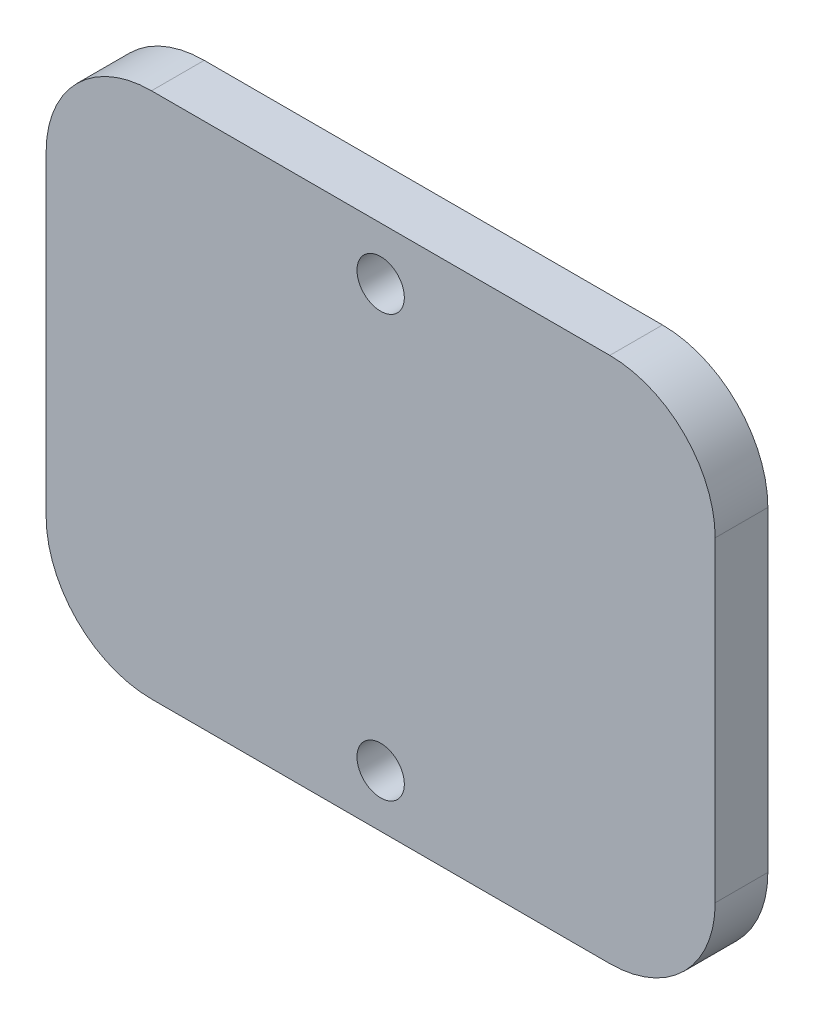
ISO-10303-21;
HEADER;
FILE_DESCRIPTION(('STEP AP214'),'2;1');
FILE_NAME('part.step','',(''),(''),'','','');
FILE_SCHEMA(('AUTOMOTIVE_DESIGN { 1 0 10303 214 1 1 1 1 }'));
ENDSEC;
DATA;
#1=APPLICATION_CONTEXT('core data for automotive mechanical design processes');
#2=APPLICATION_PROTOCOL_DEFINITION('international standard','automotive_design',2000,#1);
#3=PRODUCT_CONTEXT('',#1,'mechanical');
#4=PRODUCT('Part','Part','',(#3));
#5=PRODUCT_RELATED_PRODUCT_CATEGORY('part','',(#4));
#6=PRODUCT_DEFINITION_FORMATION('','',#4);
#7=PRODUCT_DEFINITION_CONTEXT('part definition',#1,'design');
#8=PRODUCT_DEFINITION('design','',#6,#7);
#9=PRODUCT_DEFINITION_SHAPE('','',#8);
#10=(LENGTH_UNIT() NAMED_UNIT(*) SI_UNIT(.MILLI.,.METRE.));
#11=(NAMED_UNIT(*) PLANE_ANGLE_UNIT() SI_UNIT($,.RADIAN.));
#12=(NAMED_UNIT(*) SI_UNIT($,.STERADIAN.) SOLID_ANGLE_UNIT());
#13=UNCERTAINTY_MEASURE_WITH_UNIT(LENGTH_MEASURE(1.E-05),#10,'distance_accuracy_value','');
#14=(GEOMETRIC_REPRESENTATION_CONTEXT(3) GLOBAL_UNCERTAINTY_ASSIGNED_CONTEXT((#13)) GLOBAL_UNIT_ASSIGNED_CONTEXT((#10,
#11,#12)) REPRESENTATION_CONTEXT('',''));
#15=CARTESIAN_POINT('',(0.,0.,0.));
#16=DIRECTION('',(0.,0.,1.));
#17=DIRECTION('',(1.,0.,0.));
#18=AXIS2_PLACEMENT_3D('',#15,#16,#17);
#19=CARTESIAN_POINT('',(31.75,-25.,5.));
#20=DIRECTION('',(-1.,0.,0.));
#21=DIRECTION('',(0.,0.,1.));
#22=AXIS2_PLACEMENT_3D('',#19,#20,#21);
#23=PLANE('',#22);
#24=DIRECTION('',(0.,1.,0.));
#25=VECTOR('',#24,1.);
#26=CARTESIAN_POINT('',(31.75,-25.,5.));
#27=LINE('',#26,#25);
#28=CARTESIAN_POINT('',(31.75,-15.,5.));
#29=VERTEX_POINT('',#28);
#30=CARTESIAN_POINT('',(31.75,15.,5.));
#31=VERTEX_POINT('',#30);
#32=EDGE_CURVE('E141',#29,#31,#27,.T.);
#33=ORIENTED_EDGE('',*,*,#32,.F.);
#34=DIRECTION('',(0.,0.,-1.));
#35=VECTOR('',#34,1.);
#36=CARTESIAN_POINT('',(31.75,-15.,5.));
#37=LINE('',#36,#35);
#38=CARTESIAN_POINT('',(31.75,-15.,0.));
#39=VERTEX_POINT('',#38);
#40=EDGE_CURVE('E180',#29,#39,#37,.T.);
#41=ORIENTED_EDGE('',*,*,#40,.T.);
#42=DIRECTION('',(0.,1.,0.));
#43=VECTOR('',#42,1.);
#44=CARTESIAN_POINT('',(31.75,-25.,0.));
#45=LINE('',#44,#43);
#46=CARTESIAN_POINT('',(31.75,15.,0.));
#47=VERTEX_POINT('',#46);
#48=EDGE_CURVE('E195',#39,#47,#45,.T.);
#49=ORIENTED_EDGE('',*,*,#48,.T.);
#50=DIRECTION('',(0.,0.,-1.));
#51=VECTOR('',#50,1.);
#52=CARTESIAN_POINT('',(31.75,15.,5.));
#53=LINE('',#52,#51);
#54=EDGE_CURVE('E177',#47,#31,#53,.F.);
#55=ORIENTED_EDGE('',*,*,#54,.T.);
#56=EDGE_LOOP('',(#33,#41,#49,#55));
#57=FACE_BOUND('',#56,.T.);
#58=ADVANCED_FACE('F45',(#57),#23,.F.);
#59=CARTESIAN_POINT('',(-31.75,25.,5.));
#60=DIRECTION('',(0.,-1.,0.));
#61=DIRECTION('',(0.,0.,-1.));
#62=AXIS2_PLACEMENT_3D('',#59,#60,#61);
#63=PLANE('',#62);
#64=DIRECTION('',(-1.,0.,0.));
#65=VECTOR('',#64,1.);
#66=CARTESIAN_POINT('',(-31.75,25.,5.));
#67=LINE('',#66,#65);
#68=CARTESIAN_POINT('',(21.75,25.,5.));
#69=VERTEX_POINT('',#68);
#70=CARTESIAN_POINT('',(-21.75,25.,5.));
#71=VERTEX_POINT('',#70);
#72=EDGE_CURVE('E146',#69,#71,#67,.T.);
#73=ORIENTED_EDGE('',*,*,#72,.F.);
#74=DIRECTION('',(0.,0.,-1.));
#75=VECTOR('',#74,1.);
#76=CARTESIAN_POINT('',(21.75,25.,5.));
#77=LINE('',#76,#75);
#78=CARTESIAN_POINT('',(21.75,25.,0.));
#79=VERTEX_POINT('',#78);
#80=EDGE_CURVE('E11',#69,#79,#77,.T.);
#81=ORIENTED_EDGE('',*,*,#80,.T.);
#82=DIRECTION('',(-1.,0.,0.));
#83=VECTOR('',#82,1.);
#84=CARTESIAN_POINT('',(-31.75,25.,0.));
#85=LINE('',#84,#83);
#86=CARTESIAN_POINT('',(-21.75,25.,0.));
#87=VERTEX_POINT('',#86);
#88=EDGE_CURVE('E148',#79,#87,#85,.T.);
#89=ORIENTED_EDGE('',*,*,#88,.T.);
#90=DIRECTION('',(0.,0.,-1.));
#91=VECTOR('',#90,1.);
#92=CARTESIAN_POINT('',(-21.75,25.,5.));
#93=LINE('',#92,#91);
#94=EDGE_CURVE('E54',#87,#71,#93,.F.);
#95=ORIENTED_EDGE('',*,*,#94,.T.);
#96=EDGE_LOOP('',(#73,#81,#89,#95));
#97=FACE_BOUND('',#96,.T.);
#98=ADVANCED_FACE('F201',(#97),#63,.F.);
#99=CARTESIAN_POINT('',(-31.75,-25.,5.));
#100=DIRECTION('',(1.,0.,0.));
#101=DIRECTION('',(0.,0.,-1.));
#102=AXIS2_PLACEMENT_3D('',#99,#100,#101);
#103=PLANE('',#102);
#104=DIRECTION('',(0.,-1.,0.));
#105=VECTOR('',#104,1.);
#106=CARTESIAN_POINT('',(-31.75,-25.,0.));
#107=LINE('',#106,#105);
#108=CARTESIAN_POINT('',(-31.75,15.,0.));
#109=VERTEX_POINT('',#108);
#110=CARTESIAN_POINT('',(-31.75,-15.,0.));
#111=VERTEX_POINT('',#110);
#112=EDGE_CURVE('E142',#109,#111,#107,.T.);
#113=ORIENTED_EDGE('',*,*,#112,.T.);
#114=DIRECTION('',(0.,0.,-1.));
#115=VECTOR('',#114,1.);
#116=CARTESIAN_POINT('',(-31.75,-15.,5.));
#117=LINE('',#116,#115);
#118=CARTESIAN_POINT('',(-31.75,-15.,5.));
#119=VERTEX_POINT('',#118);
#120=EDGE_CURVE('E117',#111,#119,#117,.F.);
#121=ORIENTED_EDGE('',*,*,#120,.T.);
#122=DIRECTION('',(0.,-1.,0.));
#123=VECTOR('',#122,1.);
#124=CARTESIAN_POINT('',(-31.75,-25.,5.));
#125=LINE('',#124,#123);
#126=CARTESIAN_POINT('',(-31.75,15.,5.));
#127=VERTEX_POINT('',#126);
#128=EDGE_CURVE('E186',#127,#119,#125,.T.);
#129=ORIENTED_EDGE('',*,*,#128,.F.);
#130=DIRECTION('',(0.,0.,-1.));
#131=VECTOR('',#130,1.);
#132=CARTESIAN_POINT('',(-31.75,15.,5.));
#133=LINE('',#132,#131);
#134=EDGE_CURVE('E123',#127,#109,#133,.T.);
#135=ORIENTED_EDGE('',*,*,#134,.T.);
#136=EDGE_LOOP('',(#113,#121,#129,#135));
#137=FACE_BOUND('',#136,.T.);
#138=ADVANCED_FACE('F208',(#137),#103,.F.);
#139=CARTESIAN_POINT('',(-31.75,-25.,5.));
#140=DIRECTION('',(0.,1.,0.));
#141=DIRECTION('',(0.,0.,1.));
#142=AXIS2_PLACEMENT_3D('',#139,#140,#141);
#143=PLANE('',#142);
#144=DIRECTION('',(1.,0.,0.));
#145=VECTOR('',#144,1.);
#146=CARTESIAN_POINT('',(-31.75,-25.,5.));
#147=LINE('',#146,#145);
#148=CARTESIAN_POINT('',(-21.75,-25.,5.));
#149=VERTEX_POINT('',#148);
#150=CARTESIAN_POINT('',(21.75,-25.,5.));
#151=VERTEX_POINT('',#150);
#152=EDGE_CURVE('E133',#149,#151,#147,.T.);
#153=ORIENTED_EDGE('',*,*,#152,.F.);
#154=DIRECTION('',(0.,0.,-1.));
#155=VECTOR('',#154,1.);
#156=CARTESIAN_POINT('',(-21.75,-25.,5.));
#157=LINE('',#156,#155);
#158=CARTESIAN_POINT('',(-21.75,-25.,0.));
#159=VERTEX_POINT('',#158);
#160=EDGE_CURVE('E116',#149,#159,#157,.T.);
#161=ORIENTED_EDGE('',*,*,#160,.T.);
#162=DIRECTION('',(1.,0.,0.));
#163=VECTOR('',#162,1.);
#164=CARTESIAN_POINT('',(-31.75,-25.,0.));
#165=LINE('',#164,#163);
#166=CARTESIAN_POINT('',(21.75,-25.,0.));
#167=VERTEX_POINT('',#166);
#168=EDGE_CURVE('E130',#159,#167,#165,.T.);
#169=ORIENTED_EDGE('',*,*,#168,.T.);
#170=DIRECTION('',(0.,0.,-1.));
#171=VECTOR('',#170,1.);
#172=CARTESIAN_POINT('',(21.75,-25.,5.));
#173=LINE('',#172,#171);
#174=EDGE_CURVE('E136',#167,#151,#173,.F.);
#175=ORIENTED_EDGE('',*,*,#174,.T.);
#176=EDGE_LOOP('',(#153,#161,#169,#175));
#177=FACE_BOUND('',#176,.T.);
#178=ADVANCED_FACE('F129',(#177),#143,.F.);
#179=CARTESIAN_POINT('',(0.,0.,5.));
#180=DIRECTION('',(0.,0.,-1.));
#181=DIRECTION('',(-1.,0.,0.));
#182=AXIS2_PLACEMENT_3D('',#179,#180,#181);
#183=PLANE('',#182);
#184=CARTESIAN_POINT('',(0.,20.,5.));
#185=DIRECTION('',(0.,0.,1.));
#186=DIRECTION('',(1.,0.,0.));
#187=AXIS2_PLACEMENT_3D('',#184,#185,#186);
#188=CIRCLE('',#187,2.2479);
#189=CARTESIAN_POINT('',(2.2479,20.,5.));
#190=VERTEX_POINT('',#189);
#191=EDGE_CURVE('E269',#190,#190,#188,.T.);
#192=ORIENTED_EDGE('',*,*,#191,.F.);
#193=EDGE_LOOP('',(#192));
#194=FACE_BOUND('',#193,.T.);
#195=CARTESIAN_POINT('',(0.,-20.,5.));
#196=DIRECTION('',(0.,0.,1.));
#197=DIRECTION('',(1.,0.,0.));
#198=AXIS2_PLACEMENT_3D('',#195,#196,#197);
#199=CIRCLE('',#198,2.2479);
#200=CARTESIAN_POINT('',(2.2479,-20.,5.));
#201=VERTEX_POINT('',#200);
#202=EDGE_CURVE('E266',#201,#201,#199,.T.);
#203=ORIENTED_EDGE('',*,*,#202,.F.);
#204=EDGE_LOOP('',(#203));
#205=FACE_BOUND('',#204,.T.);
#206=ORIENTED_EDGE('',*,*,#128,.T.);
#207=CARTESIAN_POINT('',(-21.75,-15.,5.));
#208=DIRECTION('',(0.,0.,-1.));
#209=DIRECTION('',(-1.,0.,0.));
#210=AXIS2_PLACEMENT_3D('',#207,#208,#209);
#211=CIRCLE('',#210,10.);
#212=EDGE_CURVE('E174',#119,#149,#211,.F.);
#213=ORIENTED_EDGE('',*,*,#212,.T.);
#214=ORIENTED_EDGE('',*,*,#152,.T.);
#215=CARTESIAN_POINT('',(21.75,-15.,5.));
#216=DIRECTION('',(0.,0.,-1.));
#217=DIRECTION('',(-1.,0.,0.));
#218=AXIS2_PLACEMENT_3D('',#215,#216,#217);
#219=CIRCLE('',#218,10.);
#220=EDGE_CURVE('E171',#151,#29,#219,.F.);
#221=ORIENTED_EDGE('',*,*,#220,.T.);
#222=ORIENTED_EDGE('',*,*,#32,.T.);
#223=CARTESIAN_POINT('',(21.75,15.,5.));
#224=DIRECTION('',(0.,0.,-1.));
#225=DIRECTION('',(-1.,0.,0.));
#226=AXIS2_PLACEMENT_3D('',#223,#224,#225);
#227=CIRCLE('',#226,10.);
#228=EDGE_CURVE('E67',#31,#69,#227,.F.);
#229=ORIENTED_EDGE('',*,*,#228,.T.);
#230=ORIENTED_EDGE('',*,*,#72,.T.);
#231=CARTESIAN_POINT('',(-21.75,15.,5.));
#232=DIRECTION('',(0.,0.,-1.));
#233=DIRECTION('',(-1.,0.,0.));
#234=AXIS2_PLACEMENT_3D('',#231,#232,#233);
#235=CIRCLE('',#234,10.);
#236=EDGE_CURVE('E166',#71,#127,#235,.F.);
#237=ORIENTED_EDGE('',*,*,#236,.T.);
#238=EDGE_LOOP('',(#206,#213,#214,#221,#222,#229,#230,#237));
#239=FACE_BOUND('',#238,.T.);
#240=ADVANCED_FACE('F206',(#194,#205,#239),#183,.F.);
#241=CARTESIAN_POINT('',(0.,0.,0.));
#242=DIRECTION('',(0.,0.,-1.));
#243=DIRECTION('',(-1.,0.,0.));
#244=AXIS2_PLACEMENT_3D('',#241,#242,#243);
#245=PLANE('',#244);
#246=CARTESIAN_POINT('',(0.,20.,0.));
#247=DIRECTION('',(0.,0.,1.));
#248=DIRECTION('',(1.,0.,0.));
#249=AXIS2_PLACEMENT_3D('',#246,#247,#248);
#250=CIRCLE('',#249,2.2479);
#251=CARTESIAN_POINT('',(2.2479,20.,0.));
#252=VERTEX_POINT('',#251);
#253=EDGE_CURVE('E198',#252,#252,#250,.T.);
#254=ORIENTED_EDGE('',*,*,#253,.T.);
#255=EDGE_LOOP('',(#254));
#256=FACE_BOUND('',#255,.T.);
#257=CARTESIAN_POINT('',(0.,-20.,0.));
#258=DIRECTION('',(0.,0.,1.));
#259=DIRECTION('',(1.,0.,0.));
#260=AXIS2_PLACEMENT_3D('',#257,#258,#259);
#261=CIRCLE('',#260,2.2479);
#262=CARTESIAN_POINT('',(2.2479,-20.,0.));
#263=VERTEX_POINT('',#262);
#264=EDGE_CURVE('E264',#263,#263,#261,.T.);
#265=ORIENTED_EDGE('',*,*,#264,.T.);
#266=EDGE_LOOP('',(#265));
#267=FACE_BOUND('',#266,.T.);
#268=ORIENTED_EDGE('',*,*,#168,.F.);
#269=CARTESIAN_POINT('',(-21.75,-15.,0.));
#270=DIRECTION('',(0.,0.,-1.));
#271=DIRECTION('',(-1.,0.,0.));
#272=AXIS2_PLACEMENT_3D('',#269,#270,#271);
#273=CIRCLE('',#272,10.);
#274=EDGE_CURVE('E112',#159,#111,#273,.T.);
#275=ORIENTED_EDGE('',*,*,#274,.T.);
#276=ORIENTED_EDGE('',*,*,#112,.F.);
#277=CARTESIAN_POINT('',(-21.75,15.,0.));
#278=DIRECTION('',(0.,0.,-1.));
#279=DIRECTION('',(-1.,0.,0.));
#280=AXIS2_PLACEMENT_3D('',#277,#278,#279);
#281=CIRCLE('',#280,10.);
#282=EDGE_CURVE('E135',#109,#87,#281,.T.);
#283=ORIENTED_EDGE('',*,*,#282,.T.);
#284=ORIENTED_EDGE('',*,*,#88,.F.);
#285=CARTESIAN_POINT('',(21.75,15.,0.));
#286=DIRECTION('',(0.,0.,-1.));
#287=DIRECTION('',(-1.,0.,0.));
#288=AXIS2_PLACEMENT_3D('',#285,#286,#287);
#289=CIRCLE('',#288,10.);
#290=EDGE_CURVE('E156',#79,#47,#289,.T.);
#291=ORIENTED_EDGE('',*,*,#290,.T.);
#292=ORIENTED_EDGE('',*,*,#48,.F.);
#293=CARTESIAN_POINT('',(21.75,-15.,0.));
#294=DIRECTION('',(0.,0.,-1.));
#295=DIRECTION('',(-1.,0.,0.));
#296=AXIS2_PLACEMENT_3D('',#293,#294,#295);
#297=CIRCLE('',#296,10.);
#298=EDGE_CURVE('E124',#39,#167,#297,.T.);
#299=ORIENTED_EDGE('',*,*,#298,.T.);
#300=EDGE_LOOP('',(#268,#275,#276,#283,#284,#291,#292,#299));
#301=FACE_BOUND('',#300,.T.);
#302=ADVANCED_FACE('F138',(#256,#267,#301),#245,.T.);
#303=CARTESIAN_POINT('',(-21.75,-15.,5.));
#304=DIRECTION('',(0.,0.,-1.));
#305=DIRECTION('',(-1.,0.,0.));
#306=AXIS2_PLACEMENT_3D('',#303,#304,#305);
#307=CYLINDRICAL_SURFACE('',#306,10.);
#308=ORIENTED_EDGE('',*,*,#212,.F.);
#309=ORIENTED_EDGE('',*,*,#120,.F.);
#310=ORIENTED_EDGE('',*,*,#274,.F.);
#311=ORIENTED_EDGE('',*,*,#160,.F.);
#312=EDGE_LOOP('',(#308,#309,#310,#311));
#313=FACE_BOUND('',#312,.T.);
#314=ADVANCED_FACE('F115',(#313),#307,.T.);
#315=CARTESIAN_POINT('',(21.75,-15.,5.));
#316=DIRECTION('',(0.,0.,-1.));
#317=DIRECTION('',(-1.,0.,0.));
#318=AXIS2_PLACEMENT_3D('',#315,#316,#317);
#319=CYLINDRICAL_SURFACE('',#318,10.);
#320=ORIENTED_EDGE('',*,*,#220,.F.);
#321=ORIENTED_EDGE('',*,*,#174,.F.);
#322=ORIENTED_EDGE('',*,*,#298,.F.);
#323=ORIENTED_EDGE('',*,*,#40,.F.);
#324=EDGE_LOOP('',(#320,#321,#322,#323));
#325=FACE_BOUND('',#324,.T.);
#326=ADVANCED_FACE('F226',(#325),#319,.T.);
#327=CARTESIAN_POINT('',(21.75,15.,5.));
#328=DIRECTION('',(0.,0.,-1.));
#329=DIRECTION('',(-1.,0.,0.));
#330=AXIS2_PLACEMENT_3D('',#327,#328,#329);
#331=CYLINDRICAL_SURFACE('',#330,10.);
#332=ORIENTED_EDGE('',*,*,#228,.F.);
#333=ORIENTED_EDGE('',*,*,#54,.F.);
#334=ORIENTED_EDGE('',*,*,#290,.F.);
#335=ORIENTED_EDGE('',*,*,#80,.F.);
#336=EDGE_LOOP('',(#332,#333,#334,#335));
#337=FACE_BOUND('',#336,.T.);
#338=ADVANCED_FACE('F228',(#337),#331,.T.);
#339=CARTESIAN_POINT('',(-21.75,15.,5.));
#340=DIRECTION('',(0.,0.,-1.));
#341=DIRECTION('',(-1.,0.,0.));
#342=AXIS2_PLACEMENT_3D('',#339,#340,#341);
#343=CYLINDRICAL_SURFACE('',#342,10.);
#344=ORIENTED_EDGE('',*,*,#236,.F.);
#345=ORIENTED_EDGE('',*,*,#94,.F.);
#346=ORIENTED_EDGE('',*,*,#282,.F.);
#347=ORIENTED_EDGE('',*,*,#134,.F.);
#348=EDGE_LOOP('',(#344,#345,#346,#347));
#349=FACE_BOUND('',#348,.T.);
#350=ADVANCED_FACE('F47',(#349),#343,.T.);
#351=CARTESIAN_POINT('',(0.,-20.,0.));
#352=DIRECTION('',(0.,0.,1.));
#353=DIRECTION('',(1.,0.,0.));
#354=AXIS2_PLACEMENT_3D('',#351,#352,#353);
#355=CYLINDRICAL_SURFACE('',#354,2.2479);
#356=ORIENTED_EDGE('',*,*,#264,.F.);
#357=EDGE_LOOP('',(#356));
#358=FACE_BOUND('',#357,.T.);
#359=ORIENTED_EDGE('',*,*,#202,.T.);
#360=EDGE_LOOP('',(#359));
#361=FACE_BOUND('',#360,.T.);
#362=ADVANCED_FACE('F235',(#358,#361),#355,.F.);
#363=CARTESIAN_POINT('',(0.,20.,0.));
#364=DIRECTION('',(0.,0.,1.));
#365=DIRECTION('',(1.,0.,0.));
#366=AXIS2_PLACEMENT_3D('',#363,#364,#365);
#367=CYLINDRICAL_SURFACE('',#366,2.2479);
#368=ORIENTED_EDGE('',*,*,#253,.F.);
#369=EDGE_LOOP('',(#368));
#370=FACE_BOUND('',#369,.T.);
#371=ORIENTED_EDGE('',*,*,#191,.T.);
#372=EDGE_LOOP('',(#371));
#373=FACE_BOUND('',#372,.T.);
#374=ADVANCED_FACE('F243',(#370,#373),#367,.F.);
#375=CLOSED_SHELL('',(#58,#98,#138,#178,#240,#302,#314,#326,#338,#350,#362,#374));
#376=MANIFOLD_SOLID_BREP('B2',#375);
#377=ADVANCED_BREP_SHAPE_REPRESENTATION('',(#18,#376),#14);
#378=SHAPE_DEFINITION_REPRESENTATION(#9,#377);
ENDSEC;
END-ISO-10303-21;
